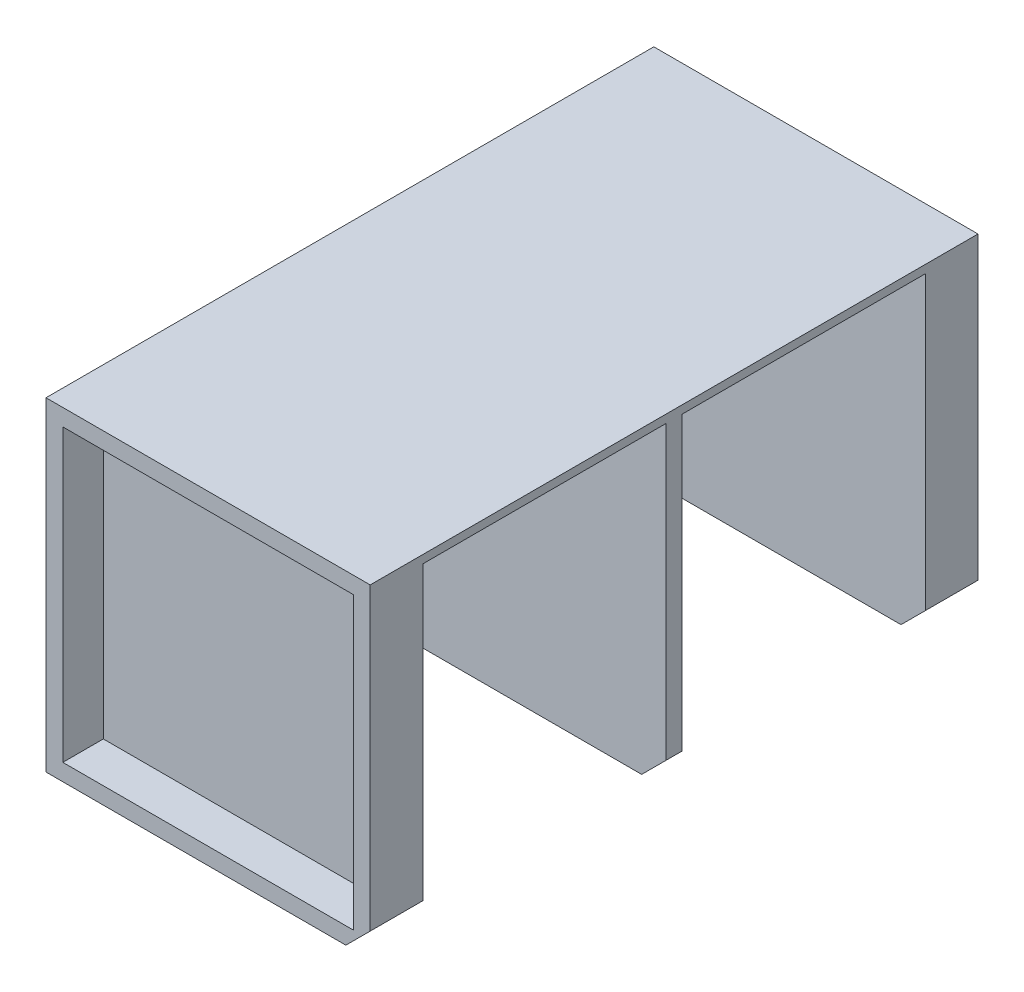
ISO-10303-21;
HEADER;
FILE_DESCRIPTION(('STEP AP214'),'2;1');
FILE_NAME('part.step','',(''),(''),'','','');
FILE_SCHEMA(('AUTOMOTIVE_DESIGN { 1 0 10303 214 1 1 1 1 }'));
ENDSEC;
DATA;
#1=APPLICATION_CONTEXT('core data for automotive mechanical design processes');
#2=APPLICATION_PROTOCOL_DEFINITION('international standard','automotive_design',2000,#1);
#3=PRODUCT_CONTEXT('',#1,'mechanical');
#4=PRODUCT('Part','Part','',(#3));
#5=PRODUCT_RELATED_PRODUCT_CATEGORY('part','',(#4));
#6=PRODUCT_DEFINITION_FORMATION('','',#4);
#7=PRODUCT_DEFINITION_CONTEXT('part definition',#1,'design');
#8=PRODUCT_DEFINITION('design','',#6,#7);
#9=PRODUCT_DEFINITION_SHAPE('','',#8);
#10=(LENGTH_UNIT() NAMED_UNIT(*) SI_UNIT(.MILLI.,.METRE.));
#11=(NAMED_UNIT(*) PLANE_ANGLE_UNIT() SI_UNIT($,.RADIAN.));
#12=(NAMED_UNIT(*) SI_UNIT($,.STERADIAN.) SOLID_ANGLE_UNIT());
#13=UNCERTAINTY_MEASURE_WITH_UNIT(LENGTH_MEASURE(1.E-05),#10,'distance_accuracy_value','');
#14=(GEOMETRIC_REPRESENTATION_CONTEXT(3) GLOBAL_UNCERTAINTY_ASSIGNED_CONTEXT((#13)) GLOBAL_UNIT_ASSIGNED_CONTEXT((#10,
#11,#12)) REPRESENTATION_CONTEXT('',''));
#15=CARTESIAN_POINT('',(0.,0.,0.));
#16=DIRECTION('',(0.,0.,1.));
#17=DIRECTION('',(1.,0.,0.));
#18=AXIS2_PLACEMENT_3D('',#15,#16,#17);
#19=CARTESIAN_POINT('',(0.,0.,0.));
#20=DIRECTION('',(0.,0.,-1.));
#21=DIRECTION('',(-1.,0.,0.));
#22=AXIS2_PLACEMENT_3D('',#19,#20,#21);
#23=PLANE('',#22);
#24=DIRECTION('',(0.,1.,0.));
#25=VECTOR('',#24,1.);
#26=CARTESIAN_POINT('',(40.,-40.,0.));
#27=LINE('',#26,#25);
#28=CARTESIAN_POINT('',(40.,-34.,0.));
#29=VERTEX_POINT('',#28);
#30=CARTESIAN_POINT('',(40.,40.,0.));
#31=VERTEX_POINT('',#30);
#32=EDGE_CURVE('E328',#29,#31,#27,.T.);
#33=ORIENTED_EDGE('',*,*,#32,.F.);
#34=DIRECTION('',(0.707106781186548,0.707106781186548,0.));
#35=VECTOR('',#34,1.);
#36=CARTESIAN_POINT('',(37.,-37.,0.));
#37=LINE('',#36,#35);
#38=CARTESIAN_POINT('',(34.,-40.,0.));
#39=VERTEX_POINT('',#38);
#40=EDGE_CURVE('E52',#29,#39,#37,.F.);
#41=ORIENTED_EDGE('',*,*,#40,.T.);
#42=DIRECTION('',(1.,0.,0.));
#43=VECTOR('',#42,1.);
#44=CARTESIAN_POINT('',(40.,-40.,0.));
#45=LINE('',#44,#43);
#46=CARTESIAN_POINT('',(-40.,-40.,0.));
#47=VERTEX_POINT('',#46);
#48=EDGE_CURVE('E339',#47,#39,#45,.T.);
#49=ORIENTED_EDGE('',*,*,#48,.F.);
#50=DIRECTION('',(0.,-1.,0.));
#51=VECTOR('',#50,1.);
#52=CARTESIAN_POINT('',(-40.,-40.,0.));
#53=LINE('',#52,#51);
#54=CARTESIAN_POINT('',(-40.,40.,0.));
#55=VERTEX_POINT('',#54);
#56=EDGE_CURVE('E337',#55,#47,#53,.T.);
#57=ORIENTED_EDGE('',*,*,#56,.F.);
#58=DIRECTION('',(-1.,0.,0.));
#59=VECTOR('',#58,1.);
#60=CARTESIAN_POINT('',(40.,40.,0.));
#61=LINE('',#60,#59);
#62=EDGE_CURVE('E317',#31,#55,#61,.T.);
#63=ORIENTED_EDGE('',*,*,#62,.F.);
#64=EDGE_LOOP('',(#33,#41,#49,#57,#63));
#65=FACE_BOUND('',#64,.T.);
#66=DIRECTION('',(-1.,0.,0.));
#67=VECTOR('',#66,1.);
#68=CARTESIAN_POINT('',(0.,-35.1507923050825,0.));
#69=LINE('',#68,#67);
#70=CARTESIAN_POINT('',(-35.1507923050825,-35.1507923050825,0.));
#71=VERTEX_POINT('',#70);
#72=CARTESIAN_POINT('',(35.1507923050825,-35.1507923050825,0.));
#73=VERTEX_POINT('',#72);
#74=EDGE_CURVE('E356',#71,#73,#69,.F.);
#75=ORIENTED_EDGE('',*,*,#74,.T.);
#76=DIRECTION('',(0.,-1.,0.));
#77=VECTOR('',#76,1.);
#78=CARTESIAN_POINT('',(35.1507923050825,0.,0.));
#79=LINE('',#78,#77);
#80=CARTESIAN_POINT('',(35.1507923050825,35.1507923050825,0.));
#81=VERTEX_POINT('',#80);
#82=EDGE_CURVE('E207',#73,#81,#79,.F.);
#83=ORIENTED_EDGE('',*,*,#82,.T.);
#84=DIRECTION('',(1.,0.,0.));
#85=VECTOR('',#84,1.);
#86=CARTESIAN_POINT('',(0.,35.1507923050825,0.));
#87=LINE('',#86,#85);
#88=CARTESIAN_POINT('',(-35.1507923050825,35.1507923050825,0.));
#89=VERTEX_POINT('',#88);
#90=EDGE_CURVE('E350',#81,#89,#87,.F.);
#91=ORIENTED_EDGE('',*,*,#90,.T.);
#92=DIRECTION('',(0.,1.,0.));
#93=VECTOR('',#92,1.);
#94=CARTESIAN_POINT('',(-35.1507923050825,0.,0.));
#95=LINE('',#94,#93);
#96=EDGE_CURVE('E353',#89,#71,#95,.F.);
#97=ORIENTED_EDGE('',*,*,#96,.T.);
#98=EDGE_LOOP('',(#75,#83,#91,#97));
#99=FACE_BOUND('',#98,.T.);
#100=ADVANCED_FACE('F43',(#65,#99),#23,.T.);
#101=CARTESIAN_POINT('',(40.,-40.,150.));
#102=DIRECTION('',(0.,1.,0.));
#103=DIRECTION('',(0.,0.,1.));
#104=AXIS2_PLACEMENT_3D('',#101,#102,#103);
#105=PLANE('',#104);
#106=DIRECTION('',(1.,0.,0.));
#107=VECTOR('',#106,1.);
#108=CARTESIAN_POINT('',(40.,-40.,137.));
#109=LINE('',#108,#107);
#110=CARTESIAN_POINT('',(-38.,-40.,137.));
#111=VERTEX_POINT('',#110);
#112=CARTESIAN_POINT('',(34.,-40.,137.));
#113=VERTEX_POINT('',#112);
#114=EDGE_CURVE('E267',#111,#113,#109,.T.);
#115=ORIENTED_EDGE('',*,*,#114,.T.);
#116=DIRECTION('',(0.,0.,1.));
#117=VECTOR('',#116,1.);
#118=CARTESIAN_POINT('',(34.,-40.,150.));
#119=LINE('',#118,#117);
#120=CARTESIAN_POINT('',(34.,-40.,150.));
#121=VERTEX_POINT('',#120);
#122=EDGE_CURVE('E66',#113,#121,#119,.T.);
#123=ORIENTED_EDGE('',*,*,#122,.T.);
#124=DIRECTION('',(1.,0.,0.));
#125=VECTOR('',#124,1.);
#126=CARTESIAN_POINT('',(40.,-40.,150.));
#127=LINE('',#126,#125);
#128=CARTESIAN_POINT('',(-40.,-40.,150.));
#129=VERTEX_POINT('',#128);
#130=EDGE_CURVE('E330',#129,#121,#127,.T.);
#131=ORIENTED_EDGE('',*,*,#130,.F.);
#132=DIRECTION('',(0.,0.,-1.));
#133=VECTOR('',#132,1.);
#134=CARTESIAN_POINT('',(-40.,-40.,150.));
#135=LINE('',#134,#133);
#136=EDGE_CURVE('E344',#129,#47,#135,.T.);
#137=ORIENTED_EDGE('',*,*,#136,.T.);
#138=ORIENTED_EDGE('',*,*,#48,.T.);
#139=DIRECTION('',(0.,0.,1.));
#140=VECTOR('',#139,1.);
#141=CARTESIAN_POINT('',(34.,-40.,150.));
#142=LINE('',#141,#140);
#143=CARTESIAN_POINT('',(34.,-40.,13.));
#144=VERTEX_POINT('',#143);
#145=EDGE_CURVE('E370',#39,#144,#142,.T.);
#146=ORIENTED_EDGE('',*,*,#145,.T.);
#147=DIRECTION('',(1.,0.,0.));
#148=VECTOR('',#147,1.);
#149=CARTESIAN_POINT('',(40.,-40.,13.));
#150=LINE('',#149,#148);
#151=CARTESIAN_POINT('',(-38.,-40.,13.));
#152=VERTEX_POINT('',#151);
#153=EDGE_CURVE('E244',#152,#144,#150,.T.);
#154=ORIENTED_EDGE('',*,*,#153,.F.);
#155=DIRECTION('',(0.,0.,1.));
#156=VECTOR('',#155,1.);
#157=CARTESIAN_POINT('',(-38.,-40.,13.));
#158=LINE('',#157,#156);
#159=CARTESIAN_POINT('',(-38.,-40.,73.));
#160=VERTEX_POINT('',#159);
#161=EDGE_CURVE('E256',#152,#160,#158,.T.);
#162=ORIENTED_EDGE('',*,*,#161,.T.);
#163=DIRECTION('',(1.,0.,0.));
#164=VECTOR('',#163,1.);
#165=CARTESIAN_POINT('',(40.,-40.,73.));
#166=LINE('',#165,#164);
#167=CARTESIAN_POINT('',(34.,-40.,73.));
#168=VERTEX_POINT('',#167);
#169=EDGE_CURVE('E238',#160,#168,#166,.T.);
#170=ORIENTED_EDGE('',*,*,#169,.T.);
#171=DIRECTION('',(0.,0.,1.));
#172=VECTOR('',#171,1.);
#173=CARTESIAN_POINT('',(34.,-40.,150.));
#174=LINE('',#173,#172);
#175=CARTESIAN_POINT('',(34.,-40.,77.));
#176=VERTEX_POINT('',#175);
#177=EDGE_CURVE('E372',#168,#176,#174,.T.);
#178=ORIENTED_EDGE('',*,*,#177,.T.);
#179=DIRECTION('',(1.,0.,0.));
#180=VECTOR('',#179,1.);
#181=CARTESIAN_POINT('',(40.,-40.,77.));
#182=LINE('',#181,#180);
#183=CARTESIAN_POINT('',(-38.,-40.,77.));
#184=VERTEX_POINT('',#183);
#185=EDGE_CURVE('E273',#184,#176,#182,.T.);
#186=ORIENTED_EDGE('',*,*,#185,.F.);
#187=DIRECTION('',(0.,0.,1.));
#188=VECTOR('',#187,1.);
#189=CARTESIAN_POINT('',(-38.,-40.,77.));
#190=LINE('',#189,#188);
#191=EDGE_CURVE('E284',#184,#111,#190,.T.);
#192=ORIENTED_EDGE('',*,*,#191,.T.);
#193=EDGE_LOOP('',(#115,#123,#131,#137,#138,#146,#154,#162,#170,#178,#186,#192));
#194=FACE_BOUND('',#193,.T.);
#195=ADVANCED_FACE('F400',(#194),#105,.F.);
#196=CARTESIAN_POINT('',(40.,-40.,150.));
#197=DIRECTION('',(-1.,0.,0.));
#198=DIRECTION('',(0.,0.,1.));
#199=AXIS2_PLACEMENT_3D('',#196,#197,#198);
#200=PLANE('',#199);
#201=DIRECTION('',(0.,1.,0.));
#202=VECTOR('',#201,1.);
#203=CARTESIAN_POINT('',(40.,-40.,150.));
#204=LINE('',#203,#202);
#205=CARTESIAN_POINT('',(40.,-34.,150.));
#206=VERTEX_POINT('',#205);
#207=CARTESIAN_POINT('',(40.,40.,150.));
#208=VERTEX_POINT('',#207);
#209=EDGE_CURVE('E332',#206,#208,#204,.T.);
#210=ORIENTED_EDGE('',*,*,#209,.F.);
#211=DIRECTION('',(0.,0.,-1.));
#212=VECTOR('',#211,1.);
#213=CARTESIAN_POINT('',(40.,-34.,150.));
#214=LINE('',#213,#212);
#215=CARTESIAN_POINT('',(40.,-34.,137.));
#216=VERTEX_POINT('',#215);
#217=EDGE_CURVE('E365',#206,#216,#214,.T.);
#218=ORIENTED_EDGE('',*,*,#217,.T.);
#219=DIRECTION('',(0.,1.,0.));
#220=VECTOR('',#219,1.);
#221=CARTESIAN_POINT('',(40.,-40.,137.));
#222=LINE('',#221,#220);
#223=CARTESIAN_POINT('',(40.,38.,137.));
#224=VERTEX_POINT('',#223);
#225=EDGE_CURVE('E259',#216,#224,#222,.T.);
#226=ORIENTED_EDGE('',*,*,#225,.T.);
#227=DIRECTION('',(0.,0.,1.));
#228=VECTOR('',#227,1.);
#229=CARTESIAN_POINT('',(40.,38.,77.));
#230=LINE('',#229,#228);
#231=CARTESIAN_POINT('',(40.,38.,77.));
#232=VERTEX_POINT('',#231);
#233=EDGE_CURVE('E276',#232,#224,#230,.T.);
#234=ORIENTED_EDGE('',*,*,#233,.F.);
#235=DIRECTION('',(0.,1.,0.));
#236=VECTOR('',#235,1.);
#237=CARTESIAN_POINT('',(40.,-40.,77.));
#238=LINE('',#237,#236);
#239=CARTESIAN_POINT('',(40.,-34.,77.));
#240=VERTEX_POINT('',#239);
#241=EDGE_CURVE('E264',#240,#232,#238,.T.);
#242=ORIENTED_EDGE('',*,*,#241,.F.);
#243=DIRECTION('',(0.,0.,-1.));
#244=VECTOR('',#243,1.);
#245=CARTESIAN_POINT('',(40.,-34.,150.));
#246=LINE('',#245,#244);
#247=CARTESIAN_POINT('',(40.,-34.,73.));
#248=VERTEX_POINT('',#247);
#249=EDGE_CURVE('E362',#240,#248,#246,.T.);
#250=ORIENTED_EDGE('',*,*,#249,.T.);
#251=DIRECTION('',(0.,1.,0.));
#252=VECTOR('',#251,1.);
#253=CARTESIAN_POINT('',(40.,-40.,73.));
#254=LINE('',#253,#252);
#255=CARTESIAN_POINT('',(40.,38.,73.));
#256=VERTEX_POINT('',#255);
#257=EDGE_CURVE('E210',#248,#256,#254,.T.);
#258=ORIENTED_EDGE('',*,*,#257,.T.);
#259=DIRECTION('',(0.,0.,1.));
#260=VECTOR('',#259,1.);
#261=CARTESIAN_POINT('',(40.,38.,13.));
#262=LINE('',#261,#260);
#263=CARTESIAN_POINT('',(40.,38.,13.));
#264=VERTEX_POINT('',#263);
#265=EDGE_CURVE('E247',#264,#256,#262,.T.);
#266=ORIENTED_EDGE('',*,*,#265,.F.);
#267=DIRECTION('',(0.,1.,0.));
#268=VECTOR('',#267,1.);
#269=CARTESIAN_POINT('',(40.,-40.,13.));
#270=LINE('',#269,#268);
#271=CARTESIAN_POINT('',(40.,-34.,13.));
#272=VERTEX_POINT('',#271);
#273=EDGE_CURVE('E235',#272,#264,#270,.T.);
#274=ORIENTED_EDGE('',*,*,#273,.F.);
#275=DIRECTION('',(0.,0.,-1.));
#276=VECTOR('',#275,1.);
#277=CARTESIAN_POINT('',(40.,-34.,150.));
#278=LINE('',#277,#276);
#279=EDGE_CURVE('E359',#272,#29,#278,.T.);
#280=ORIENTED_EDGE('',*,*,#279,.T.);
#281=ORIENTED_EDGE('',*,*,#32,.T.);
#282=DIRECTION('',(0.,0.,-1.));
#283=VECTOR('',#282,1.);
#284=CARTESIAN_POINT('',(40.,40.,150.));
#285=LINE('',#284,#283);
#286=EDGE_CURVE('E334',#208,#31,#285,.T.);
#287=ORIENTED_EDGE('',*,*,#286,.F.);
#288=EDGE_LOOP('',(#210,#218,#226,#234,#242,#250,#258,#266,#274,#280,#281,#287));
#289=FACE_BOUND('',#288,.T.);
#290=ADVANCED_FACE('F392',(#289),#200,.F.);
#291=CARTESIAN_POINT('',(40.,40.,150.));
#292=DIRECTION('',(0.,-1.,0.));
#293=DIRECTION('',(0.,0.,-1.));
#294=AXIS2_PLACEMENT_3D('',#291,#292,#293);
#295=PLANE('',#294);
#296=ORIENTED_EDGE('',*,*,#62,.T.);
#297=DIRECTION('',(0.,0.,-1.));
#298=VECTOR('',#297,1.);
#299=CARTESIAN_POINT('',(-40.,40.,150.));
#300=LINE('',#299,#298);
#301=CARTESIAN_POINT('',(-40.,40.,150.));
#302=VERTEX_POINT('',#301);
#303=EDGE_CURVE('E347',#302,#55,#300,.T.);
#304=ORIENTED_EDGE('',*,*,#303,.F.);
#305=DIRECTION('',(-1.,0.,0.));
#306=VECTOR('',#305,1.);
#307=CARTESIAN_POINT('',(40.,40.,150.));
#308=LINE('',#307,#306);
#309=EDGE_CURVE('E324',#208,#302,#308,.T.);
#310=ORIENTED_EDGE('',*,*,#309,.F.);
#311=ORIENTED_EDGE('',*,*,#286,.T.);
#312=EDGE_LOOP('',(#296,#304,#310,#311));
#313=FACE_BOUND('',#312,.T.);
#314=ADVANCED_FACE('F424',(#313),#295,.F.);
#315=CARTESIAN_POINT('',(-40.,-40.,150.));
#316=DIRECTION('',(1.,0.,0.));
#317=DIRECTION('',(0.,0.,-1.));
#318=AXIS2_PLACEMENT_3D('',#315,#316,#317);
#319=PLANE('',#318);
#320=ORIENTED_EDGE('',*,*,#56,.T.);
#321=ORIENTED_EDGE('',*,*,#136,.F.);
#322=DIRECTION('',(0.,-1.,0.));
#323=VECTOR('',#322,1.);
#324=CARTESIAN_POINT('',(-40.,-40.,150.));
#325=LINE('',#324,#323);
#326=EDGE_CURVE('E327',#302,#129,#325,.T.);
#327=ORIENTED_EDGE('',*,*,#326,.F.);
#328=ORIENTED_EDGE('',*,*,#303,.T.);
#329=EDGE_LOOP('',(#320,#321,#327,#328));
#330=FACE_BOUND('',#329,.T.);
#331=ADVANCED_FACE('F421',(#330),#319,.F.);
#332=CARTESIAN_POINT('',(0.,0.,150.));
#333=DIRECTION('',(0.,0.,-1.));
#334=DIRECTION('',(-1.,0.,0.));
#335=AXIS2_PLACEMENT_3D('',#332,#333,#334);
#336=PLANE('',#335);
#337=DIRECTION('',(-1.,0.,0.));
#338=VECTOR('',#337,1.);
#339=CARTESIAN_POINT('',(-35.85,35.85,150.));
#340=LINE('',#339,#338);
#341=CARTESIAN_POINT('',(35.85,35.85,150.));
#342=VERTEX_POINT('',#341);
#343=CARTESIAN_POINT('',(-35.85,35.85,150.));
#344=VERTEX_POINT('',#343);
#345=EDGE_CURVE('E307',#342,#344,#340,.T.);
#346=ORIENTED_EDGE('',*,*,#345,.F.);
#347=DIRECTION('',(0.,1.,0.));
#348=VECTOR('',#347,1.);
#349=CARTESIAN_POINT('',(35.85,-35.85,150.));
#350=LINE('',#349,#348);
#351=CARTESIAN_POINT('',(35.85,-35.85,150.));
#352=VERTEX_POINT('',#351);
#353=EDGE_CURVE('E287',#352,#342,#350,.T.);
#354=ORIENTED_EDGE('',*,*,#353,.F.);
#355=DIRECTION('',(1.,0.,0.));
#356=VECTOR('',#355,1.);
#357=CARTESIAN_POINT('',(-35.85,-35.85,150.));
#358=LINE('',#357,#356);
#359=CARTESIAN_POINT('',(-35.85,-35.85,150.));
#360=VERTEX_POINT('',#359);
#361=EDGE_CURVE('E296',#360,#352,#358,.T.);
#362=ORIENTED_EDGE('',*,*,#361,.F.);
#363=DIRECTION('',(0.,-1.,0.));
#364=VECTOR('',#363,1.);
#365=CARTESIAN_POINT('',(-35.85,-35.85,150.));
#366=LINE('',#365,#364);
#367=EDGE_CURVE('E310',#344,#360,#366,.T.);
#368=ORIENTED_EDGE('',*,*,#367,.F.);
#369=EDGE_LOOP('',(#346,#354,#362,#368));
#370=FACE_BOUND('',#369,.T.);
#371=ORIENTED_EDGE('',*,*,#130,.T.);
#372=DIRECTION('',(-0.707106781186548,-0.707106781186548,0.));
#373=VECTOR('',#372,1.);
#374=CARTESIAN_POINT('',(40.,-34.,150.));
#375=LINE('',#374,#373);
#376=EDGE_CURVE('E375',#121,#206,#375,.F.);
#377=ORIENTED_EDGE('',*,*,#376,.T.);
#378=ORIENTED_EDGE('',*,*,#209,.T.);
#379=ORIENTED_EDGE('',*,*,#309,.T.);
#380=ORIENTED_EDGE('',*,*,#326,.T.);
#381=EDGE_LOOP('',(#371,#377,#378,#379,#380));
#382=FACE_BOUND('',#381,.T.);
#383=ADVANCED_FACE('F462',(#370,#382),#336,.F.);
#384=CARTESIAN_POINT('',(35.85,-35.85,140.));
#385=DIRECTION('',(1.,0.,0.));
#386=DIRECTION('',(0.,0.,-1.));
#387=AXIS2_PLACEMENT_3D('',#384,#385,#386);
#388=PLANE('',#387);
#389=ORIENTED_EDGE('',*,*,#353,.T.);
#390=DIRECTION('',(0.,0.,1.));
#391=VECTOR('',#390,1.);
#392=CARTESIAN_POINT('',(35.85,35.85,140.));
#393=LINE('',#392,#391);
#394=CARTESIAN_POINT('',(35.85,35.85,140.));
#395=VERTEX_POINT('',#394);
#396=EDGE_CURVE('E305',#395,#342,#393,.T.);
#397=ORIENTED_EDGE('',*,*,#396,.F.);
#398=DIRECTION('',(0.,1.,0.));
#399=VECTOR('',#398,1.);
#400=CARTESIAN_POINT('',(35.85,-35.85,140.));
#401=LINE('',#400,#399);
#402=CARTESIAN_POINT('',(35.85,-35.85,140.));
#403=VERTEX_POINT('',#402);
#404=EDGE_CURVE('E292',#403,#395,#401,.T.);
#405=ORIENTED_EDGE('',*,*,#404,.F.);
#406=DIRECTION('',(0.,0.,1.));
#407=VECTOR('',#406,1.);
#408=CARTESIAN_POINT('',(35.85,-35.85,140.));
#409=LINE('',#408,#407);
#410=EDGE_CURVE('E315',#403,#352,#409,.T.);
#411=ORIENTED_EDGE('',*,*,#410,.T.);
#412=EDGE_LOOP('',(#389,#397,#405,#411));
#413=FACE_BOUND('',#412,.T.);
#414=ADVANCED_FACE('F647',(#413),#388,.F.);
#415=CARTESIAN_POINT('',(-35.85,-35.85,140.));
#416=DIRECTION('',(0.,-1.,0.));
#417=DIRECTION('',(0.,0.,-1.));
#418=AXIS2_PLACEMENT_3D('',#415,#416,#417);
#419=PLANE('',#418);
#420=ORIENTED_EDGE('',*,*,#361,.T.);
#421=ORIENTED_EDGE('',*,*,#410,.F.);
#422=DIRECTION('',(1.,0.,0.));
#423=VECTOR('',#422,1.);
#424=CARTESIAN_POINT('',(-35.85,-35.85,140.));
#425=LINE('',#424,#423);
#426=CARTESIAN_POINT('',(-35.85,-35.85,140.));
#427=VERTEX_POINT('',#426);
#428=EDGE_CURVE('E302',#427,#403,#425,.T.);
#429=ORIENTED_EDGE('',*,*,#428,.F.);
#430=DIRECTION('',(0.,0.,1.));
#431=VECTOR('',#430,1.);
#432=CARTESIAN_POINT('',(-35.85,-35.85,140.));
#433=LINE('',#432,#431);
#434=EDGE_CURVE('E318',#427,#360,#433,.T.);
#435=ORIENTED_EDGE('',*,*,#434,.T.);
#436=EDGE_LOOP('',(#420,#421,#429,#435));
#437=FACE_BOUND('',#436,.T.);
#438=ADVANCED_FACE('F637',(#437),#419,.F.);
#439=CARTESIAN_POINT('',(-35.85,-35.85,140.));
#440=DIRECTION('',(-1.,0.,0.));
#441=DIRECTION('',(0.,0.,1.));
#442=AXIS2_PLACEMENT_3D('',#439,#440,#441);
#443=PLANE('',#442);
#444=ORIENTED_EDGE('',*,*,#367,.T.);
#445=ORIENTED_EDGE('',*,*,#434,.F.);
#446=DIRECTION('',(0.,-1.,0.));
#447=VECTOR('',#446,1.);
#448=CARTESIAN_POINT('',(-35.85,-35.85,140.));
#449=LINE('',#448,#447);
#450=CARTESIAN_POINT('',(-35.85,35.85,140.));
#451=VERTEX_POINT('',#450);
#452=EDGE_CURVE('E299',#451,#427,#449,.T.);
#453=ORIENTED_EDGE('',*,*,#452,.F.);
#454=DIRECTION('',(0.,0.,1.));
#455=VECTOR('',#454,1.);
#456=CARTESIAN_POINT('',(-35.85,35.85,140.));
#457=LINE('',#456,#455);
#458=EDGE_CURVE('E320',#451,#344,#457,.T.);
#459=ORIENTED_EDGE('',*,*,#458,.T.);
#460=EDGE_LOOP('',(#444,#445,#453,#459));
#461=FACE_BOUND('',#460,.T.);
#462=ADVANCED_FACE('F627',(#461),#443,.F.);
#463=CARTESIAN_POINT('',(-35.85,35.85,140.));
#464=DIRECTION('',(0.,1.,0.));
#465=DIRECTION('',(0.,0.,1.));
#466=AXIS2_PLACEMENT_3D('',#463,#464,#465);
#467=PLANE('',#466);
#468=ORIENTED_EDGE('',*,*,#345,.T.);
#469=ORIENTED_EDGE('',*,*,#458,.F.);
#470=DIRECTION('',(-1.,0.,0.));
#471=VECTOR('',#470,1.);
#472=CARTESIAN_POINT('',(-35.85,35.85,140.));
#473=LINE('',#472,#471);
#474=EDGE_CURVE('E295',#395,#451,#473,.T.);
#475=ORIENTED_EDGE('',*,*,#474,.F.);
#476=ORIENTED_EDGE('',*,*,#396,.T.);
#477=EDGE_LOOP('',(#468,#469,#475,#476));
#478=FACE_BOUND('',#477,.T.);
#479=ADVANCED_FACE('F618',(#478),#467,.F.);
#480=CARTESIAN_POINT('',(0.,0.,140.));
#481=DIRECTION('',(0.,0.,-1.));
#482=DIRECTION('',(-1.,0.,0.));
#483=AXIS2_PLACEMENT_3D('',#480,#481,#482);
#484=PLANE('',#483);
#485=ORIENTED_EDGE('',*,*,#404,.T.);
#486=ORIENTED_EDGE('',*,*,#474,.T.);
#487=ORIENTED_EDGE('',*,*,#452,.T.);
#488=ORIENTED_EDGE('',*,*,#428,.T.);
#489=EDGE_LOOP('',(#485,#486,#487,#488));
#490=FACE_BOUND('',#489,.T.);
#491=ADVANCED_FACE('F450',(#490),#484,.F.);
#492=CARTESIAN_POINT('',(-38.,-40.,77.));
#493=DIRECTION('',(-1.,0.,0.));
#494=DIRECTION('',(0.,0.,1.));
#495=AXIS2_PLACEMENT_3D('',#492,#493,#494);
#496=PLANE('',#495);
#497=DIRECTION('',(0.,-1.,0.));
#498=VECTOR('',#497,1.);
#499=CARTESIAN_POINT('',(-38.,-40.,137.));
#500=LINE('',#499,#498);
#501=CARTESIAN_POINT('',(-38.,38.,137.));
#502=VERTEX_POINT('',#501);
#503=EDGE_CURVE('E281',#502,#111,#500,.T.);
#504=ORIENTED_EDGE('',*,*,#503,.T.);
#505=ORIENTED_EDGE('',*,*,#191,.F.);
#506=DIRECTION('',(0.,-1.,0.));
#507=VECTOR('',#506,1.);
#508=CARTESIAN_POINT('',(-38.,-40.,77.));
#509=LINE('',#508,#507);
#510=CARTESIAN_POINT('',(-38.,38.,77.));
#511=VERTEX_POINT('',#510);
#512=EDGE_CURVE('E270',#511,#184,#509,.T.);
#513=ORIENTED_EDGE('',*,*,#512,.F.);
#514=DIRECTION('',(0.,0.,1.));
#515=VECTOR('',#514,1.);
#516=CARTESIAN_POINT('',(-38.,38.,77.));
#517=LINE('',#516,#515);
#518=EDGE_CURVE('E288',#511,#502,#517,.T.);
#519=ORIENTED_EDGE('',*,*,#518,.T.);
#520=EDGE_LOOP('',(#504,#505,#513,#519));
#521=FACE_BOUND('',#520,.T.);
#522=ADVANCED_FACE('F439',(#521),#496,.F.);
#523=CARTESIAN_POINT('',(40.,38.,77.));
#524=DIRECTION('',(0.,1.,0.));
#525=DIRECTION('',(-1.,0.,0.));
#526=AXIS2_PLACEMENT_3D('',#523,#524,#525);
#527=PLANE('',#526);
#528=DIRECTION('',(-1.,0.,0.));
#529=VECTOR('',#528,1.);
#530=CARTESIAN_POINT('',(40.,38.,137.));
#531=LINE('',#530,#529);
#532=EDGE_CURVE('E278',#224,#502,#531,.T.);
#533=ORIENTED_EDGE('',*,*,#532,.T.);
#534=ORIENTED_EDGE('',*,*,#518,.F.);
#535=DIRECTION('',(-1.,0.,0.));
#536=VECTOR('',#535,1.);
#537=CARTESIAN_POINT('',(40.,38.,77.));
#538=LINE('',#537,#536);
#539=EDGE_CURVE('E266',#232,#511,#538,.T.);
#540=ORIENTED_EDGE('',*,*,#539,.F.);
#541=ORIENTED_EDGE('',*,*,#233,.T.);
#542=EDGE_LOOP('',(#533,#534,#540,#541));
#543=FACE_BOUND('',#542,.T.);
#544=ADVANCED_FACE('F441',(#543),#527,.F.);
#545=CARTESIAN_POINT('',(0.,0.,77.));
#546=DIRECTION('',(0.,0.,1.));
#547=DIRECTION('',(1.,0.,0.));
#548=AXIS2_PLACEMENT_3D('',#545,#546,#547);
#549=PLANE('',#548);
#550=ORIENTED_EDGE('',*,*,#185,.T.);
#551=DIRECTION('',(-0.707106781186548,-0.707106781186548,0.));
#552=VECTOR('',#551,1.);
#553=CARTESIAN_POINT('',(37.,-37.,77.));
#554=LINE('',#553,#552);
#555=EDGE_CURVE('E379',#176,#240,#554,.F.);
#556=ORIENTED_EDGE('',*,*,#555,.T.);
#557=ORIENTED_EDGE('',*,*,#241,.T.);
#558=ORIENTED_EDGE('',*,*,#539,.T.);
#559=ORIENTED_EDGE('',*,*,#512,.T.);
#560=EDGE_LOOP('',(#550,#556,#557,#558,#559));
#561=FACE_BOUND('',#560,.T.);
#562=ADVANCED_FACE('F383',(#561),#549,.T.);
#563=CARTESIAN_POINT('',(0.,0.,137.));
#564=DIRECTION('',(0.,0.,1.));
#565=DIRECTION('',(1.,0.,0.));
#566=AXIS2_PLACEMENT_3D('',#563,#564,#565);
#567=PLANE('',#566);
#568=ORIENTED_EDGE('',*,*,#225,.F.);
#569=DIRECTION('',(0.707106781186548,0.707106781186548,0.));
#570=VECTOR('',#569,1.);
#571=CARTESIAN_POINT('',(40.,-34.,137.));
#572=LINE('',#571,#570);
#573=EDGE_CURVE('E368',#216,#113,#572,.F.);
#574=ORIENTED_EDGE('',*,*,#573,.T.);
#575=ORIENTED_EDGE('',*,*,#114,.F.);
#576=ORIENTED_EDGE('',*,*,#503,.F.);
#577=ORIENTED_EDGE('',*,*,#532,.F.);
#578=EDGE_LOOP('',(#568,#574,#575,#576,#577));
#579=FACE_BOUND('',#578,.T.);
#580=ADVANCED_FACE('F434',(#579),#567,.F.);
#581=CARTESIAN_POINT('',(-38.,-40.,13.));
#582=DIRECTION('',(-1.,0.,0.));
#583=DIRECTION('',(0.,0.,1.));
#584=AXIS2_PLACEMENT_3D('',#581,#582,#583);
#585=PLANE('',#584);
#586=DIRECTION('',(0.,-1.,0.));
#587=VECTOR('',#586,1.);
#588=CARTESIAN_POINT('',(-38.,-40.,73.));
#589=LINE('',#588,#587);
#590=CARTESIAN_POINT('',(-38.,38.,73.));
#591=VERTEX_POINT('',#590);
#592=EDGE_CURVE('E252',#591,#160,#589,.T.);
#593=ORIENTED_EDGE('',*,*,#592,.T.);
#594=ORIENTED_EDGE('',*,*,#161,.F.);
#595=DIRECTION('',(0.,-1.,0.));
#596=VECTOR('',#595,1.);
#597=CARTESIAN_POINT('',(-38.,-40.,13.));
#598=LINE('',#597,#596);
#599=CARTESIAN_POINT('',(-38.,38.,13.));
#600=VERTEX_POINT('',#599);
#601=EDGE_CURVE('E241',#600,#152,#598,.T.);
#602=ORIENTED_EDGE('',*,*,#601,.F.);
#603=DIRECTION('',(0.,0.,1.));
#604=VECTOR('',#603,1.);
#605=CARTESIAN_POINT('',(-38.,38.,13.));
#606=LINE('',#605,#604);
#607=EDGE_CURVE('E260',#600,#591,#606,.T.);
#608=ORIENTED_EDGE('',*,*,#607,.T.);
#609=EDGE_LOOP('',(#593,#594,#602,#608));
#610=FACE_BOUND('',#609,.T.);
#611=ADVANCED_FACE('F404',(#610),#585,.F.);
#612=CARTESIAN_POINT('',(40.,38.,13.));
#613=DIRECTION('',(0.,1.,0.));
#614=DIRECTION('',(-1.,0.,0.));
#615=AXIS2_PLACEMENT_3D('',#612,#613,#614);
#616=PLANE('',#615);
#617=DIRECTION('',(-1.,0.,0.));
#618=VECTOR('',#617,1.);
#619=CARTESIAN_POINT('',(40.,38.,73.));
#620=LINE('',#619,#618);
#621=EDGE_CURVE('E249',#256,#591,#620,.T.);
#622=ORIENTED_EDGE('',*,*,#621,.T.);
#623=ORIENTED_EDGE('',*,*,#607,.F.);
#624=DIRECTION('',(-1.,0.,0.));
#625=VECTOR('',#624,1.);
#626=CARTESIAN_POINT('',(40.,38.,13.));
#627=LINE('',#626,#625);
#628=EDGE_CURVE('E237',#264,#600,#627,.T.);
#629=ORIENTED_EDGE('',*,*,#628,.F.);
#630=ORIENTED_EDGE('',*,*,#265,.T.);
#631=EDGE_LOOP('',(#622,#623,#629,#630));
#632=FACE_BOUND('',#631,.T.);
#633=ADVANCED_FACE('F412',(#632),#616,.F.);
#634=CARTESIAN_POINT('',(0.,0.,13.));
#635=DIRECTION('',(0.,0.,1.));
#636=DIRECTION('',(1.,0.,0.));
#637=AXIS2_PLACEMENT_3D('',#634,#635,#636);
#638=PLANE('',#637);
#639=ORIENTED_EDGE('',*,*,#153,.T.);
#640=DIRECTION('',(-0.707106781186548,-0.707106781186548,0.));
#641=VECTOR('',#640,1.);
#642=CARTESIAN_POINT('',(37.,-37.,13.));
#643=LINE('',#642,#641);
#644=EDGE_CURVE('E11',#144,#272,#643,.F.);
#645=ORIENTED_EDGE('',*,*,#644,.T.);
#646=ORIENTED_EDGE('',*,*,#273,.T.);
#647=ORIENTED_EDGE('',*,*,#628,.T.);
#648=ORIENTED_EDGE('',*,*,#601,.T.);
#649=EDGE_LOOP('',(#639,#645,#646,#647,#648));
#650=FACE_BOUND('',#649,.T.);
#651=ADVANCED_FACE('F406',(#650),#638,.T.);
#652=CARTESIAN_POINT('',(0.,0.,73.));
#653=DIRECTION('',(0.,0.,1.));
#654=DIRECTION('',(1.,0.,0.));
#655=AXIS2_PLACEMENT_3D('',#652,#653,#654);
#656=PLANE('',#655);
#657=ORIENTED_EDGE('',*,*,#257,.F.);
#658=DIRECTION('',(0.707106781186548,0.707106781186548,0.));
#659=VECTOR('',#658,1.);
#660=CARTESIAN_POINT('',(40.,-34.,73.));
#661=LINE('',#660,#659);
#662=EDGE_CURVE('E377',#248,#168,#661,.F.);
#663=ORIENTED_EDGE('',*,*,#662,.T.);
#664=ORIENTED_EDGE('',*,*,#169,.F.);
#665=ORIENTED_EDGE('',*,*,#592,.F.);
#666=ORIENTED_EDGE('',*,*,#621,.F.);
#667=EDGE_LOOP('',(#657,#663,#664,#665,#666));
#668=FACE_BOUND('',#667,.T.);
#669=ADVANCED_FACE('F397',(#668),#656,.F.);
#670=CARTESIAN_POINT('',(35.5,35.5,9.99999999999998));
#671=DIRECTION('',(0.999390827019096,0.,-0.034899496702501));
#672=DIRECTION('',(-0.034899496702501,0.,-0.999390827019096));
#673=AXIS2_PLACEMENT_3D('',#670,#671,#672);
#674=PLANE('',#673);
#675=DIRECTION('',(0.0348782627423747,-0.0348782627423747,0.998782765958718));
#676=VECTOR('',#675,1.);
#677=CARTESIAN_POINT('',(35.4136289819532,-35.4136289819533,7.52665765090985));
#678=LINE('',#677,#676);
#679=CARTESIAN_POINT('',(35.5,-35.5,9.99999999999998));
#680=VERTEX_POINT('',#679);
#681=EDGE_CURVE('E200',#73,#680,#678,.T.);
#682=ORIENTED_EDGE('',*,*,#681,.T.);
#683=DIRECTION('',(0.,-1.,0.));
#684=VECTOR('',#683,1.);
#685=CARTESIAN_POINT('',(35.5,35.5,9.99999999999998));
#686=LINE('',#685,#684);
#687=CARTESIAN_POINT('',(35.5,35.5,9.99999999999998));
#688=VERTEX_POINT('',#687);
#689=EDGE_CURVE('E205',#688,#680,#686,.T.);
#690=ORIENTED_EDGE('',*,*,#689,.F.);
#691=DIRECTION('',(0.0348782627423747,0.0348782627423747,0.998782765958718));
#692=VECTOR('',#691,1.);
#693=CARTESIAN_POINT('',(35.5,35.5,9.99999999999998));
#694=LINE('',#693,#692);
#695=EDGE_CURVE('E229',#81,#688,#694,.T.);
#696=ORIENTED_EDGE('',*,*,#695,.F.);
#697=ORIENTED_EDGE('',*,*,#82,.F.);
#698=EDGE_LOOP('',(#682,#690,#696,#697));
#699=FACE_BOUND('',#698,.T.);
#700=ADVANCED_FACE('F202',(#699),#674,.F.);
#701=CARTESIAN_POINT('',(-35.5,-35.5,9.99999999999998));
#702=DIRECTION('',(0.,-0.999390827019096,-0.034899496702501));
#703=DIRECTION('',(0.,0.034899496702501,-0.999390827019096));
#704=AXIS2_PLACEMENT_3D('',#701,#702,#703);
#705=PLANE('',#704);
#706=DIRECTION('',(-0.0348782627423747,-0.0348782627423747,0.998782765958718));
#707=VECTOR('',#706,1.);
#708=CARTESIAN_POINT('',(-35.4136289819533,-35.4136289819532,7.52665765090985));
#709=LINE('',#708,#707);
#710=CARTESIAN_POINT('',(-35.5,-35.5,9.99999999999998));
#711=VERTEX_POINT('',#710);
#712=EDGE_CURVE('E211',#71,#711,#709,.T.);
#713=ORIENTED_EDGE('',*,*,#712,.T.);
#714=DIRECTION('',(-1.,0.,0.));
#715=VECTOR('',#714,1.);
#716=CARTESIAN_POINT('',(-35.5,-35.5,9.99999999999998));
#717=LINE('',#716,#715);
#718=EDGE_CURVE('E214',#680,#711,#717,.T.);
#719=ORIENTED_EDGE('',*,*,#718,.F.);
#720=ORIENTED_EDGE('',*,*,#681,.F.);
#721=ORIENTED_EDGE('',*,*,#74,.F.);
#722=EDGE_LOOP('',(#713,#719,#720,#721));
#723=FACE_BOUND('',#722,.T.);
#724=ADVANCED_FACE('F215',(#723),#705,.F.);
#725=CARTESIAN_POINT('',(-35.5,35.5,9.99999999999998));
#726=DIRECTION('',(-0.999390827019096,0.,-0.034899496702501));
#727=DIRECTION('',(-0.034899496702501,0.,0.999390827019096));
#728=AXIS2_PLACEMENT_3D('',#725,#726,#727);
#729=PLANE('',#728);
#730=DIRECTION('',(-0.0348782627423747,0.0348782627423747,0.998782765958718));
#731=VECTOR('',#730,1.);
#732=CARTESIAN_POINT('',(-35.5,35.5,9.99999999999998));
#733=LINE('',#732,#731);
#734=CARTESIAN_POINT('',(-35.5,35.5,9.99999999999998));
#735=VERTEX_POINT('',#734);
#736=EDGE_CURVE('E232',#89,#735,#733,.T.);
#737=ORIENTED_EDGE('',*,*,#736,.T.);
#738=DIRECTION('',(0.,1.,0.));
#739=VECTOR('',#738,1.);
#740=CARTESIAN_POINT('',(-35.5,35.5,9.99999999999998));
#741=LINE('',#740,#739);
#742=EDGE_CURVE('E220',#711,#735,#741,.T.);
#743=ORIENTED_EDGE('',*,*,#742,.F.);
#744=ORIENTED_EDGE('',*,*,#712,.F.);
#745=ORIENTED_EDGE('',*,*,#96,.F.);
#746=EDGE_LOOP('',(#737,#743,#744,#745));
#747=FACE_BOUND('',#746,.T.);
#748=ADVANCED_FACE('F512',(#747),#729,.F.);
#749=CARTESIAN_POINT('',(-35.5,35.5,9.99999999999998));
#750=DIRECTION('',(0.,0.999390827019096,-0.034899496702501));
#751=DIRECTION('',(0.,0.034899496702501,0.999390827019096));
#752=AXIS2_PLACEMENT_3D('',#749,#750,#751);
#753=PLANE('',#752);
#754=ORIENTED_EDGE('',*,*,#695,.T.);
#755=DIRECTION('',(1.,0.,0.));
#756=VECTOR('',#755,1.);
#757=CARTESIAN_POINT('',(-35.5,35.5,9.99999999999998));
#758=LINE('',#757,#756);
#759=EDGE_CURVE('E225',#735,#688,#758,.T.);
#760=ORIENTED_EDGE('',*,*,#759,.F.);
#761=ORIENTED_EDGE('',*,*,#736,.F.);
#762=ORIENTED_EDGE('',*,*,#90,.F.);
#763=EDGE_LOOP('',(#754,#760,#761,#762));
#764=FACE_BOUND('',#763,.T.);
#765=ADVANCED_FACE('F503',(#764),#753,.F.);
#766=CARTESIAN_POINT('',(0.,0.,9.99999999999998));
#767=DIRECTION('',(0.,0.,1.));
#768=DIRECTION('',(1.,0.,0.));
#769=AXIS2_PLACEMENT_3D('',#766,#767,#768);
#770=PLANE('',#769);
#771=ORIENTED_EDGE('',*,*,#689,.T.);
#772=ORIENTED_EDGE('',*,*,#718,.T.);
#773=ORIENTED_EDGE('',*,*,#742,.T.);
#774=ORIENTED_EDGE('',*,*,#759,.T.);
#775=EDGE_LOOP('',(#771,#772,#773,#774));
#776=FACE_BOUND('',#775,.T.);
#777=ADVANCED_FACE('F223',(#776),#770,.F.);
#778=CARTESIAN_POINT('',(40.,-34.,150.));
#779=DIRECTION('',(-0.707106781186547,0.707106781186547,0.));
#780=DIRECTION('',(0.,0.,-1.));
#781=AXIS2_PLACEMENT_3D('',#778,#779,#780);
#782=PLANE('',#781);
#783=ORIENTED_EDGE('',*,*,#376,.F.);
#784=ORIENTED_EDGE('',*,*,#122,.F.);
#785=ORIENTED_EDGE('',*,*,#573,.F.);
#786=ORIENTED_EDGE('',*,*,#217,.F.);
#787=EDGE_LOOP('',(#783,#784,#785,#786));
#788=FACE_BOUND('',#787,.T.);
#789=ADVANCED_FACE('F431',(#788),#782,.F.);
#790=CARTESIAN_POINT('',(40.,-34.,150.));
#791=DIRECTION('',(-0.707106781186547,0.707106781186547,0.));
#792=DIRECTION('',(0.,0.,-1.));
#793=AXIS2_PLACEMENT_3D('',#790,#791,#792);
#794=PLANE('',#793);
#795=ORIENTED_EDGE('',*,*,#555,.F.);
#796=ORIENTED_EDGE('',*,*,#177,.F.);
#797=ORIENTED_EDGE('',*,*,#662,.F.);
#798=ORIENTED_EDGE('',*,*,#249,.F.);
#799=EDGE_LOOP('',(#795,#796,#797,#798));
#800=FACE_BOUND('',#799,.T.);
#801=ADVANCED_FACE('F394',(#800),#794,.F.);
#802=CARTESIAN_POINT('',(40.,-34.,150.));
#803=DIRECTION('',(-0.707106781186547,0.707106781186547,0.));
#804=DIRECTION('',(0.,0.,-1.));
#805=AXIS2_PLACEMENT_3D('',#802,#803,#804);
#806=PLANE('',#805);
#807=ORIENTED_EDGE('',*,*,#644,.F.);
#808=ORIENTED_EDGE('',*,*,#145,.F.);
#809=ORIENTED_EDGE('',*,*,#40,.F.);
#810=ORIENTED_EDGE('',*,*,#279,.F.);
#811=EDGE_LOOP('',(#807,#808,#809,#810));
#812=FACE_BOUND('',#811,.T.);
#813=ADVANCED_FACE('F46',(#812),#806,.F.);
#814=CLOSED_SHELL('',(#100,#195,#290,#314,#331,#383,#414,#438,#462,#479,#491,#522,#544,#562,
#580,#611,#633,#651,#669,#700,#724,#748,#765,#777,#789,#801,#813));
#815=MANIFOLD_SOLID_BREP('B2',#814);
#816=ADVANCED_BREP_SHAPE_REPRESENTATION('',(#18,#815),#14);
#817=SHAPE_DEFINITION_REPRESENTATION(#9,#816);
ENDSEC;
END-ISO-10303-21;
